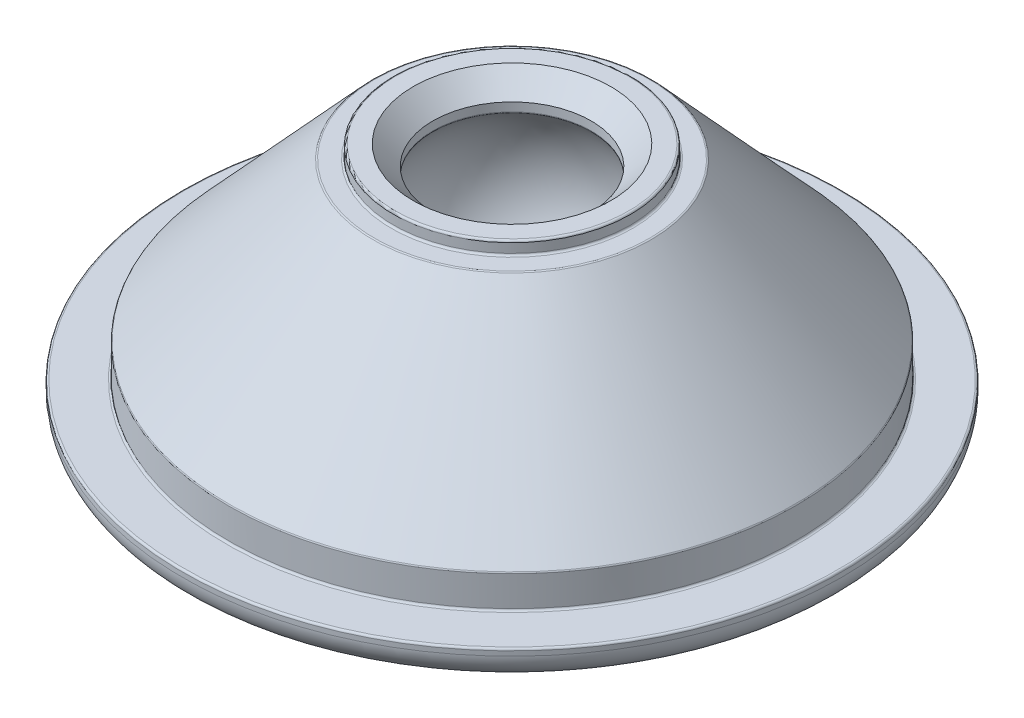
ISO-10303-21;
HEADER;
FILE_DESCRIPTION(('STEP AP214'),'2;1');
FILE_NAME('part.step','',(''),(''),'','','');
FILE_SCHEMA(('AUTOMOTIVE_DESIGN { 1 0 10303 214 1 1 1 1 }'));
ENDSEC;
DATA;
#1=APPLICATION_CONTEXT('core data for automotive mechanical design processes');
#2=APPLICATION_PROTOCOL_DEFINITION('international standard','automotive_design',2000,#1);
#3=PRODUCT_CONTEXT('',#1,'mechanical');
#4=PRODUCT('Part','Part','',(#3));
#5=PRODUCT_RELATED_PRODUCT_CATEGORY('part','',(#4));
#6=PRODUCT_DEFINITION_FORMATION('','',#4);
#7=PRODUCT_DEFINITION_CONTEXT('part definition',#1,'design');
#8=PRODUCT_DEFINITION('design','',#6,#7);
#9=PRODUCT_DEFINITION_SHAPE('','',#8);
#10=(LENGTH_UNIT() NAMED_UNIT(*) SI_UNIT(.MILLI.,.METRE.));
#11=(NAMED_UNIT(*) PLANE_ANGLE_UNIT() SI_UNIT($,.RADIAN.));
#12=(NAMED_UNIT(*) SI_UNIT($,.STERADIAN.) SOLID_ANGLE_UNIT());
#13=UNCERTAINTY_MEASURE_WITH_UNIT(LENGTH_MEASURE(1.E-05),#10,'distance_accuracy_value','');
#14=(GEOMETRIC_REPRESENTATION_CONTEXT(3) GLOBAL_UNCERTAINTY_ASSIGNED_CONTEXT((#13)) GLOBAL_UNIT_ASSIGNED_CONTEXT((#10,
#11,#12)) REPRESENTATION_CONTEXT('',''));
#15=CARTESIAN_POINT('',(0.,0.,0.));
#16=DIRECTION('',(0.,0.,1.));
#17=DIRECTION('',(1.,0.,0.));
#18=AXIS2_PLACEMENT_3D('',#15,#16,#17);
#19=CARTESIAN_POINT('',(0.,15.5,0.));
#20=DIRECTION('',(0.,1.,0.));
#21=DIRECTION('',(-1.00000000000001,0.,0.));
#22=AXIS2_PLACEMENT_3D('',#19,#20,#21);
#23=CYLINDRICAL_SURFACE('',#22,25.);
#24=CARTESIAN_POINT('',(0.,-0.149999999999983,0.));
#25=DIRECTION('',(0.,1.,0.));
#26=DIRECTION('',(-1.00000000000001,0.,0.));
#27=AXIS2_PLACEMENT_3D('',#24,#25,#26);
#28=CIRCLE('',#27,25.);
#29=CARTESIAN_POINT('',(-25.0000000000002,-0.149999999999987,0.));
#30=VERTEX_POINT('',#29);
#31=EDGE_CURVE('E83',#30,#30,#28,.F.);
#32=ORIENTED_EDGE('',*,*,#31,.T.);
#33=EDGE_LOOP('',(#32));
#34=FACE_BOUND('',#33,.T.);
#35=CARTESIAN_POINT('',(0.,-0.500000000000056,0.));
#36=DIRECTION('',(0.,-1.,0.));
#37=DIRECTION('',(1.00000000000001,0.,0.));
#38=AXIS2_PLACEMENT_3D('',#35,#36,#37);
#39=CIRCLE('',#38,25.);
#40=CARTESIAN_POINT('',(25.0000000000002,-0.500000000000053,0.));
#41=VERTEX_POINT('',#40);
#42=EDGE_CURVE('E113',#41,#41,#39,.F.);
#43=ORIENTED_EDGE('',*,*,#42,.T.);
#44=EDGE_LOOP('',(#43));
#45=FACE_BOUND('',#44,.T.);
#46=ADVANCED_FACE('F41',(#34,#45),#23,.T.);
#47=CARTESIAN_POINT('',(-24.9999999999956,-2.50000000000045,1.33226762955019E-12));
#48=DIRECTION('',(0.,-1.,0.));
#49=DIRECTION('',(1.00000000000001,0.,0.));
#50=AXIS2_PLACEMENT_3D('',#47,#48,#49);
#51=PLANE('',#50);
#52=CARTESIAN_POINT('',(3.77475828372553E-12,-2.49999999999995,3.33066907387547E-13));
#53=DIRECTION('',(0.,-1.,0.));
#54=DIRECTION('',(1.00000000000001,0.,0.));
#55=AXIS2_PLACEMENT_3D('',#52,#53,#54);
#56=CIRCLE('',#55,23.);
#57=CARTESIAN_POINT('',(23.0000000000039,-2.49999999999994,3.2923663795259E-13));
#58=VERTEX_POINT('',#57);
#59=EDGE_CURVE('E107',#58,#58,#56,.T.);
#60=ORIENTED_EDGE('',*,*,#59,.T.);
#61=EDGE_LOOP('',(#60));
#62=FACE_BOUND('',#61,.T.);
#63=CARTESIAN_POINT('',(3.77475828372553E-12,-2.49999999999995,3.33066907387547E-13));
#64=DIRECTION('',(0.,-1.,0.));
#65=DIRECTION('',(1.00000000000001,0.,0.));
#66=AXIS2_PLACEMENT_3D('',#63,#64,#65);
#67=CIRCLE('',#66,21.);
#68=CARTESIAN_POINT('',(21.0000000000039,-2.49999999999994,3.29569704859978E-13));
#69=VERTEX_POINT('',#68);
#70=EDGE_CURVE('E110',#69,#69,#67,.F.);
#71=ORIENTED_EDGE('',*,*,#70,.T.);
#72=EDGE_LOOP('',(#71));
#73=FACE_BOUND('',#72,.T.);
#74=ADVANCED_FACE('F137',(#62,#73),#51,.T.);
#75=CARTESIAN_POINT('',(0.,15.5,0.));
#76=DIRECTION('',(0.,1.,0.));
#77=DIRECTION('',(-1.00000000000001,0.,0.));
#78=AXIS2_PLACEMENT_3D('',#75,#76,#77);
#79=CYLINDRICAL_SURFACE('',#78,19.);
#80=CARTESIAN_POINT('',(0.,1.46919322003047,0.));
#81=DIRECTION('',(0.,1.,0.));
#82=DIRECTION('',(-1.00000000000001,0.,0.));
#83=AXIS2_PLACEMENT_3D('',#80,#81,#82);
#84=CIRCLE('',#83,19.);
#85=CARTESIAN_POINT('',(-19.0000000000001,1.46919322003047,0.));
#86=VERTEX_POINT('',#85);
#87=EDGE_CURVE('E101',#86,#86,#84,.T.);
#88=ORIENTED_EDGE('',*,*,#87,.T.);
#89=EDGE_LOOP('',(#88));
#90=FACE_BOUND('',#89,.T.);
#91=CARTESIAN_POINT('',(0.,-0.500000000000056,0.));
#92=DIRECTION('',(0.,-1.,0.));
#93=DIRECTION('',(1.00000000000001,0.,0.));
#94=AXIS2_PLACEMENT_3D('',#91,#92,#93);
#95=CIRCLE('',#94,19.);
#96=CARTESIAN_POINT('',(19.0000000000001,-0.500000000000054,0.));
#97=VERTEX_POINT('',#96);
#98=EDGE_CURVE('E104',#97,#97,#95,.T.);
#99=ORIENTED_EDGE('',*,*,#98,.T.);
#100=EDGE_LOOP('',(#99));
#101=FACE_BOUND('',#100,.T.);
#102=ADVANCED_FACE('F133',(#90,#101),#79,.F.);
#103=CARTESIAN_POINT('',(0.,1.52754077361372,0.));
#104=DIRECTION('',(0.,-1.,0.));
#105=DIRECTION('',(1.00000000000001,0.,0.));
#106=AXIS2_PLACEMENT_3D('',#103,#104,#105);
#107=CONICAL_SURFACE('',#106,19.,0.741947268005917);
#108=CARTESIAN_POINT('',(0.,1.5705519143081,0.));
#109=DIRECTION('',(0.,-1.,0.));
#110=DIRECTION('',(1.00000000000001,0.,0.));
#111=AXIS2_PLACEMENT_3D('',#108,#109,#110);
#112=CIRCLE('',#111,18.9605731210301);
#113=CARTESIAN_POINT('',(18.9605731210302,1.57055191430811,0.));
#114=VERTEX_POINT('',#113);
#115=EDGE_CURVE('E98',#114,#114,#112,.T.);
#116=ORIENTED_EDGE('',*,*,#115,.T.);
#117=EDGE_LOOP('',(#116));
#118=FACE_BOUND('',#117,.T.);
#119=CARTESIAN_POINT('',(0.,11.4278635870061,0.));
#120=DIRECTION('',(0.,1.,0.));
#121=DIRECTION('',(-1.00000000000001,0.,0.));
#122=AXIS2_PLACEMENT_3D('',#119,#120,#121);
#123=CIRCLE('',#122,9.92470408772359);
#124=CARTESIAN_POINT('',(-9.92470408772366,11.4278635870061,0.));
#125=VERTEX_POINT('',#124);
#126=EDGE_CURVE('E116',#125,#125,#123,.T.);
#127=ORIENTED_EDGE('',*,*,#126,.T.);
#128=EDGE_LOOP('',(#127));
#129=FACE_BOUND('',#128,.T.);
#130=ADVANCED_FACE('F120',(#118,#129),#107,.F.);
#131=CARTESIAN_POINT('',(0.,8.00000000000001,0.));
#132=DIRECTION('',(0.,1.,0.));
#133=DIRECTION('',(-1.00000000000001,0.,0.));
#134=AXIS2_PLACEMENT_3D('',#131,#132,#133);
#135=SPHERICAL_SURFACE('',#134,10.5);
#136=ORIENTED_EDGE('',*,*,#126,.F.);
#137=EDGE_LOOP('',(#136));
#138=FACE_BOUND('',#137,.T.);
#139=ADVANCED_FACE('F122',(#138),#135,.T.);
#140=CARTESIAN_POINT('',(0.,8.00000000000001,0.));
#141=DIRECTION('',(0.,1.,0.));
#142=DIRECTION('',(-1.00000000000001,0.,0.));
#143=AXIS2_PLACEMENT_3D('',#140,#141,#142);
#144=SPHERICAL_SURFACE('',#143,8.);
#145=CARTESIAN_POINT('',(0.,13.2494692346978,0.));
#146=DIRECTION('',(0.,-1.,0.));
#147=DIRECTION('',(1.00000000000001,0.,0.));
#148=AXIS2_PLACEMENT_3D('',#145,#146,#147);
#149=CIRCLE('',#148,6.03680981595092);
#150=CARTESIAN_POINT('',(6.03680981595096,13.2494692346978,0.));
#151=VERTEX_POINT('',#150);
#152=EDGE_CURVE('E95',#151,#151,#149,.F.);
#153=ORIENTED_EDGE('',*,*,#152,.T.);
#154=EDGE_LOOP('',(#153));
#155=FACE_BOUND('',#154,.T.);
#156=ADVANCED_FACE('F124',(#155),#144,.F.);
#157=CARTESIAN_POINT('',(0.,15.5,0.));
#158=DIRECTION('',(0.,1.,0.));
#159=DIRECTION('',(-1.00000000000001,0.,0.));
#160=AXIS2_PLACEMENT_3D('',#157,#158,#159);
#161=CYLINDRICAL_SURFACE('',#160,6.);
#162=CARTESIAN_POINT('',(0.,14.,0.));
#163=DIRECTION('',(0.,1.,0.));
#164=DIRECTION('',(-1.00000000000001,0.,0.));
#165=AXIS2_PLACEMENT_3D('',#162,#163,#164);
#166=CIRCLE('',#165,6.);
#167=CARTESIAN_POINT('',(-6.00000000000004,14.,0.));
#168=VERTEX_POINT('',#167);
#169=EDGE_CURVE('E49',#168,#168,#166,.T.);
#170=ORIENTED_EDGE('',*,*,#169,.T.);
#171=EDGE_LOOP('',(#170));
#172=FACE_BOUND('',#171,.T.);
#173=CARTESIAN_POINT('',(0.,13.3478967828484,0.));
#174=DIRECTION('',(0.,-1.,0.));
#175=DIRECTION('',(1.00000000000001,0.,0.));
#176=AXIS2_PLACEMENT_3D('',#173,#174,#175);
#177=CIRCLE('',#176,6.);
#178=CARTESIAN_POINT('',(6.00000000000004,13.3478967828484,0.));
#179=VERTEX_POINT('',#178);
#180=EDGE_CURVE('E92',#179,#179,#177,.T.);
#181=ORIENTED_EDGE('',*,*,#180,.T.);
#182=EDGE_LOOP('',(#181));
#183=FACE_BOUND('',#182,.T.);
#184=ADVANCED_FACE('F130',(#172,#183),#161,.F.);
#185=CARTESIAN_POINT('',(-8.99999999999879,15.4999999999996,1.11022302462516E-12));
#186=DIRECTION('',(0.,1.,0.));
#187=DIRECTION('',(-1.00000000000001,0.,0.));
#188=AXIS2_PLACEMENT_3D('',#185,#186,#187);
#189=PLANE('',#188);
#190=CARTESIAN_POINT('',(0.,15.5,0.));
#191=DIRECTION('',(0.,1.,0.));
#192=DIRECTION('',(-1.00000000000001,0.,0.));
#193=AXIS2_PLACEMENT_3D('',#190,#191,#192);
#194=CIRCLE('',#193,7.50000000000002);
#195=CARTESIAN_POINT('',(-7.50000000000007,15.5,0.));
#196=VERTEX_POINT('',#195);
#197=EDGE_CURVE('E10',#196,#196,#194,.F.);
#198=ORIENTED_EDGE('',*,*,#197,.T.);
#199=EDGE_LOOP('',(#198));
#200=FACE_BOUND('',#199,.T.);
#201=CARTESIAN_POINT('',(0.,15.5,0.));
#202=DIRECTION('',(0.,1.,0.));
#203=DIRECTION('',(-1.00000000000001,0.,0.));
#204=AXIS2_PLACEMENT_3D('',#201,#202,#203);
#205=CIRCLE('',#204,8.85);
#206=CARTESIAN_POINT('',(-8.85000000000006,15.5,0.));
#207=VERTEX_POINT('',#206);
#208=EDGE_CURVE('E53',#207,#207,#205,.T.);
#209=ORIENTED_EDGE('',*,*,#208,.T.);
#210=EDGE_LOOP('',(#209));
#211=FACE_BOUND('',#210,.T.);
#212=ADVANCED_FACE('F195',(#200,#211),#189,.T.);
#213=CARTESIAN_POINT('',(0.,15.5,0.));
#214=DIRECTION('',(0.,1.,0.));
#215=DIRECTION('',(-1.00000000000001,0.,0.));
#216=AXIS2_PLACEMENT_3D('',#213,#214,#215);
#217=CYLINDRICAL_SURFACE('',#216,9.);
#218=CARTESIAN_POINT('',(0.,14.6500000000001,0.));
#219=DIRECTION('',(0.,1.,0.));
#220=DIRECTION('',(-1.00000000000001,0.,0.));
#221=AXIS2_PLACEMENT_3D('',#218,#219,#220);
#222=CIRCLE('',#221,9.);
#223=CARTESIAN_POINT('',(-9.00000000000006,14.6500000000001,0.));
#224=VERTEX_POINT('',#223);
#225=EDGE_CURVE('E57',#224,#224,#222,.T.);
#226=ORIENTED_EDGE('',*,*,#225,.T.);
#227=EDGE_LOOP('',(#226));
#228=FACE_BOUND('',#227,.T.);
#229=CARTESIAN_POINT('',(0.,15.35,0.));
#230=DIRECTION('',(0.,1.,0.));
#231=DIRECTION('',(-1.00000000000001,0.,0.));
#232=AXIS2_PLACEMENT_3D('',#229,#230,#231);
#233=CIRCLE('',#232,9.);
#234=CARTESIAN_POINT('',(-9.00000000000006,15.35,0.));
#235=VERTEX_POINT('',#234);
#236=EDGE_CURVE('E62',#235,#235,#233,.F.);
#237=ORIENTED_EDGE('',*,*,#236,.T.);
#238=EDGE_LOOP('',(#237));
#239=FACE_BOUND('',#238,.T.);
#240=ADVANCED_FACE('F197',(#228,#239),#217,.T.);
#241=CARTESIAN_POINT('',(-10.4999999999984,14.4999999999996,7.7715611723761E-13));
#242=DIRECTION('',(0.,1.,0.));
#243=DIRECTION('',(-1.00000000000001,0.,0.));
#244=AXIS2_PLACEMENT_3D('',#241,#242,#243);
#245=PLANE('',#244);
#246=CARTESIAN_POINT('',(0.,14.5,0.));
#247=DIRECTION('',(0.,1.,0.));
#248=DIRECTION('',(-1.00000000000001,0.,0.));
#249=AXIS2_PLACEMENT_3D('',#246,#247,#248);
#250=CIRCLE('',#249,10.4340147425488);
#251=CARTESIAN_POINT('',(-10.4340147425488,14.5,0.));
#252=VERTEX_POINT('',#251);
#253=EDGE_CURVE('E65',#252,#252,#250,.T.);
#254=ORIENTED_EDGE('',*,*,#253,.T.);
#255=EDGE_LOOP('',(#254));
#256=FACE_BOUND('',#255,.T.);
#257=CARTESIAN_POINT('',(0.,14.5,0.));
#258=DIRECTION('',(0.,1.,0.));
#259=DIRECTION('',(-1.00000000000001,0.,0.));
#260=AXIS2_PLACEMENT_3D('',#257,#258,#259);
#261=CIRCLE('',#260,9.15);
#262=CARTESIAN_POINT('',(-9.15000000000006,14.5,0.));
#263=VERTEX_POINT('',#262);
#264=EDGE_CURVE('E68',#263,#263,#261,.F.);
#265=ORIENTED_EDGE('',*,*,#264,.T.);
#266=EDGE_LOOP('',(#265));
#267=FACE_BOUND('',#266,.T.);
#268=ADVANCED_FACE('F203',(#256,#267),#245,.T.);
#269=CARTESIAN_POINT('',(0.,14.5,0.));
#270=DIRECTION('',(0.,-1.,0.));
#271=DIRECTION('',(1.00000000000001,0.,0.));
#272=AXIS2_PLACEMENT_3D('',#269,#270,#271);
#273=CONICAL_SURFACE('',#272,10.5,0.741947268005917);
#274=CARTESIAN_POINT('',(0.,2.54301114069444,0.));
#275=DIRECTION('',(0.,1.,0.));
#276=DIRECTION('',(-1.00000000000001,0.,0.));
#277=AXIS2_PLACEMENT_3D('',#274,#275,#276);
#278=CIRCLE('',#277,21.4605731210301);
#279=CARTESIAN_POINT('',(-21.4605731210302,2.54301114069444,0.));
#280=VERTEX_POINT('',#279);
#281=EDGE_CURVE('E71',#280,#280,#278,.T.);
#282=ORIENTED_EDGE('',*,*,#281,.T.);
#283=EDGE_LOOP('',(#282));
#284=FACE_BOUND('',#283,.T.);
#285=CARTESIAN_POINT('',(0.,14.4513586942776,0.));
#286=DIRECTION('',(0.,1.,0.));
#287=DIRECTION('',(-1.00000000000001,0.,0.));
#288=AXIS2_PLACEMENT_3D('',#285,#286,#287);
#289=CIRCLE('',#288,10.5445878635789);
#290=CARTESIAN_POINT('',(-10.5445878635789,14.4513586942776,0.));
#291=VERTEX_POINT('',#290);
#292=EDGE_CURVE('E74',#291,#291,#289,.F.);
#293=ORIENTED_EDGE('',*,*,#292,.T.);
#294=EDGE_LOOP('',(#293));
#295=FACE_BOUND('',#294,.T.);
#296=ADVANCED_FACE('F210',(#284,#295),#273,.T.);
#297=CARTESIAN_POINT('',(0.,15.5,0.));
#298=DIRECTION('',(0.,1.,0.));
#299=DIRECTION('',(-1.00000000000001,0.,0.));
#300=AXIS2_PLACEMENT_3D('',#297,#298,#299);
#301=CYLINDRICAL_SURFACE('',#300,21.5);
#302=CARTESIAN_POINT('',(0.,0.149999999999983,0.));
#303=DIRECTION('',(0.,1.,0.));
#304=DIRECTION('',(-1.00000000000001,0.,0.));
#305=AXIS2_PLACEMENT_3D('',#302,#303,#304);
#306=CIRCLE('',#305,21.5);
#307=CARTESIAN_POINT('',(-21.5000000000001,0.149999999999981,0.));
#308=VERTEX_POINT('',#307);
#309=EDGE_CURVE('E77',#308,#308,#306,.T.);
#310=ORIENTED_EDGE('',*,*,#309,.T.);
#311=EDGE_LOOP('',(#310));
#312=FACE_BOUND('',#311,.T.);
#313=CARTESIAN_POINT('',(0.,2.44165244641681,0.));
#314=DIRECTION('',(0.,-1.,0.));
#315=DIRECTION('',(1.00000000000001,0.,0.));
#316=AXIS2_PLACEMENT_3D('',#313,#314,#315);
#317=CIRCLE('',#316,21.5);
#318=CARTESIAN_POINT('',(21.5000000000001,2.44165244641681,0.));
#319=VERTEX_POINT('',#318);
#320=EDGE_CURVE('E80',#319,#319,#317,.T.);
#321=ORIENTED_EDGE('',*,*,#320,.T.);
#322=EDGE_LOOP('',(#321));
#323=FACE_BOUND('',#322,.T.);
#324=ADVANCED_FACE('F214',(#312,#323),#301,.T.);
#325=CARTESIAN_POINT('',(-24.9999999999987,-2.77555756156289E-13,1.27675647831893E-12));
#326=DIRECTION('',(0.,1.,0.));
#327=DIRECTION('',(-1.00000000000001,0.,0.));
#328=AXIS2_PLACEMENT_3D('',#325,#326,#327);
#329=PLANE('',#328);
#330=CARTESIAN_POINT('',(0.,0.,0.));
#331=DIRECTION('',(0.,1.,0.));
#332=DIRECTION('',(-1.00000000000001,0.,0.));
#333=AXIS2_PLACEMENT_3D('',#330,#331,#332);
#334=CIRCLE('',#333,24.85);
#335=CARTESIAN_POINT('',(-24.8500000000002,0.,0.));
#336=VERTEX_POINT('',#335);
#337=EDGE_CURVE('E86',#336,#336,#334,.T.);
#338=ORIENTED_EDGE('',*,*,#337,.T.);
#339=EDGE_LOOP('',(#338));
#340=FACE_BOUND('',#339,.T.);
#341=CARTESIAN_POINT('',(0.,0.,0.));
#342=DIRECTION('',(0.,1.,0.));
#343=DIRECTION('',(-1.00000000000001,0.,0.));
#344=AXIS2_PLACEMENT_3D('',#341,#342,#343);
#345=CIRCLE('',#344,21.65);
#346=CARTESIAN_POINT('',(-21.6500000000001,0.,0.));
#347=VERTEX_POINT('',#346);
#348=EDGE_CURVE('E89',#347,#347,#345,.F.);
#349=ORIENTED_EDGE('',*,*,#348,.T.);
#350=EDGE_LOOP('',(#349));
#351=FACE_BOUND('',#350,.T.);
#352=ADVANCED_FACE('F152',(#340,#351),#329,.T.);
#353=CARTESIAN_POINT('',(0.,-0.500000000000056,0.));
#354=DIRECTION('',(0.,-1.,0.));
#355=DIRECTION('',(1.00000000000001,0.,0.));
#356=AXIS2_PLACEMENT_3D('',#353,#354,#355);
#357=TOROIDAL_SURFACE('',#356,23.,2.);
#358=ORIENTED_EDGE('',*,*,#59,.F.);
#359=EDGE_LOOP('',(#358));
#360=FACE_BOUND('',#359,.T.);
#361=ORIENTED_EDGE('',*,*,#42,.F.);
#362=EDGE_LOOP('',(#361));
#363=FACE_BOUND('',#362,.T.);
#364=ADVANCED_FACE('F148',(#360,#363),#357,.T.);
#365=CARTESIAN_POINT('',(0.,-0.500000000000056,0.));
#366=DIRECTION('',(0.,-1.,0.));
#367=DIRECTION('',(1.00000000000001,0.,0.));
#368=AXIS2_PLACEMENT_3D('',#365,#366,#367);
#369=TOROIDAL_SURFACE('',#368,21.,2.);
#370=ORIENTED_EDGE('',*,*,#98,.F.);
#371=EDGE_LOOP('',(#370));
#372=FACE_BOUND('',#371,.T.);
#373=ORIENTED_EDGE('',*,*,#70,.F.);
#374=EDGE_LOOP('',(#373));
#375=FACE_BOUND('',#374,.T.);
#376=ADVANCED_FACE('F151',(#372,#375),#369,.T.);
#377=CARTESIAN_POINT('',(0.,1.46919322003047,0.));
#378=DIRECTION('',(0.,1.,0.));
#379=DIRECTION('',(-1.00000000000001,0.,0.));
#380=AXIS2_PLACEMENT_3D('',#377,#378,#379);
#381=TOROIDAL_SURFACE('',#380,18.85,0.15);
#382=ORIENTED_EDGE('',*,*,#115,.F.);
#383=EDGE_LOOP('',(#382));
#384=FACE_BOUND('',#383,.T.);
#385=ORIENTED_EDGE('',*,*,#87,.F.);
#386=EDGE_LOOP('',(#385));
#387=FACE_BOUND('',#386,.T.);
#388=ADVANCED_FACE('F156',(#384,#387),#381,.F.);
#389=CARTESIAN_POINT('',(0.,13.3478967828484,0.));
#390=DIRECTION('',(0.,-1.,0.));
#391=DIRECTION('',(1.00000000000001,0.,0.));
#392=AXIS2_PLACEMENT_3D('',#389,#390,#391);
#393=TOROIDAL_SURFACE('',#392,6.15,0.15);
#394=ORIENTED_EDGE('',*,*,#180,.F.);
#395=EDGE_LOOP('',(#394));
#396=FACE_BOUND('',#395,.T.);
#397=ORIENTED_EDGE('',*,*,#152,.F.);
#398=EDGE_LOOP('',(#397));
#399=FACE_BOUND('',#398,.T.);
#400=ADVANCED_FACE('F160',(#396,#399),#393,.T.);
#401=CARTESIAN_POINT('',(0.,-0.149999999999983,0.));
#402=DIRECTION('',(0.,1.,0.));
#403=DIRECTION('',(-1.00000000000001,0.,0.));
#404=AXIS2_PLACEMENT_3D('',#401,#402,#403);
#405=TOROIDAL_SURFACE('',#404,24.85,0.15);
#406=ORIENTED_EDGE('',*,*,#31,.F.);
#407=EDGE_LOOP('',(#406));
#408=FACE_BOUND('',#407,.T.);
#409=ORIENTED_EDGE('',*,*,#337,.F.);
#410=EDGE_LOOP('',(#409));
#411=FACE_BOUND('',#410,.T.);
#412=ADVANCED_FACE('F164',(#408,#411),#405,.T.);
#413=CARTESIAN_POINT('',(0.,0.149999999999983,0.));
#414=DIRECTION('',(0.,1.,0.));
#415=DIRECTION('',(-1.00000000000001,0.,0.));
#416=AXIS2_PLACEMENT_3D('',#413,#414,#415);
#417=TOROIDAL_SURFACE('',#416,21.65,0.15);
#418=ORIENTED_EDGE('',*,*,#348,.F.);
#419=EDGE_LOOP('',(#418));
#420=FACE_BOUND('',#419,.T.);
#421=ORIENTED_EDGE('',*,*,#309,.F.);
#422=EDGE_LOOP('',(#421));
#423=FACE_BOUND('',#422,.T.);
#424=ADVANCED_FACE('F168',(#420,#423),#417,.F.);
#425=CARTESIAN_POINT('',(0.,2.44165244641681,0.));
#426=DIRECTION('',(0.,-1.,0.));
#427=DIRECTION('',(1.00000000000001,0.,0.));
#428=AXIS2_PLACEMENT_3D('',#425,#426,#427);
#429=TOROIDAL_SURFACE('',#428,21.35,0.15);
#430=ORIENTED_EDGE('',*,*,#320,.F.);
#431=EDGE_LOOP('',(#430));
#432=FACE_BOUND('',#431,.T.);
#433=ORIENTED_EDGE('',*,*,#281,.F.);
#434=EDGE_LOOP('',(#433));
#435=FACE_BOUND('',#434,.T.);
#436=ADVANCED_FACE('F172',(#432,#435),#429,.T.);
#437=CARTESIAN_POINT('',(0.,14.35,0.));
#438=DIRECTION('',(0.,1.,0.));
#439=DIRECTION('',(-1.00000000000001,0.,0.));
#440=AXIS2_PLACEMENT_3D('',#437,#438,#439);
#441=TOROIDAL_SURFACE('',#440,10.4340147425488,0.15);
#442=ORIENTED_EDGE('',*,*,#292,.F.);
#443=EDGE_LOOP('',(#442));
#444=FACE_BOUND('',#443,.T.);
#445=ORIENTED_EDGE('',*,*,#253,.F.);
#446=EDGE_LOOP('',(#445));
#447=FACE_BOUND('',#446,.T.);
#448=ADVANCED_FACE('F176',(#444,#447),#441,.T.);
#449=CARTESIAN_POINT('',(0.,14.6500000000001,0.));
#450=DIRECTION('',(0.,1.,0.));
#451=DIRECTION('',(-1.00000000000001,0.,0.));
#452=AXIS2_PLACEMENT_3D('',#449,#450,#451);
#453=TOROIDAL_SURFACE('',#452,9.15,0.15);
#454=ORIENTED_EDGE('',*,*,#264,.F.);
#455=EDGE_LOOP('',(#454));
#456=FACE_BOUND('',#455,.T.);
#457=ORIENTED_EDGE('',*,*,#225,.F.);
#458=EDGE_LOOP('',(#457));
#459=FACE_BOUND('',#458,.T.);
#460=ADVANCED_FACE('F180',(#456,#459),#453,.F.);
#461=CARTESIAN_POINT('',(0.,15.35,0.));
#462=DIRECTION('',(0.,1.,0.));
#463=DIRECTION('',(-1.00000000000001,0.,0.));
#464=AXIS2_PLACEMENT_3D('',#461,#462,#463);
#465=TOROIDAL_SURFACE('',#464,8.85,0.15);
#466=ORIENTED_EDGE('',*,*,#236,.F.);
#467=EDGE_LOOP('',(#466));
#468=FACE_BOUND('',#467,.T.);
#469=ORIENTED_EDGE('',*,*,#208,.F.);
#470=EDGE_LOOP('',(#469));
#471=FACE_BOUND('',#470,.T.);
#472=ADVANCED_FACE('F183',(#468,#471),#465,.T.);
#473=CARTESIAN_POINT('',(0.,14.,0.));
#474=DIRECTION('',(0.,1.,0.));
#475=DIRECTION('',(-1.00000000000001,0.,0.));
#476=AXIS2_PLACEMENT_3D('',#473,#474,#475);
#477=CONICAL_SURFACE('',#476,6.,0.785398163397453);
#478=ORIENTED_EDGE('',*,*,#197,.F.);
#479=EDGE_LOOP('',(#478));
#480=FACE_BOUND('',#479,.T.);
#481=ORIENTED_EDGE('',*,*,#169,.F.);
#482=EDGE_LOOP('',(#481));
#483=FACE_BOUND('',#482,.T.);
#484=ADVANCED_FACE('F44',(#480,#483),#477,.F.);
#485=CLOSED_SHELL('',(#46,#74,#102,#130,#139,#156,#184,#212,#240,#268,#296,#324,#352,#364,#376,
#388,#400,#412,#424,#436,#448,#460,#472,#484));
#486=MANIFOLD_SOLID_BREP('B2',#485);
#487=ADVANCED_BREP_SHAPE_REPRESENTATION('',(#18,#486),#14);
#488=SHAPE_DEFINITION_REPRESENTATION(#9,#487);
ENDSEC;
END-ISO-10303-21;
